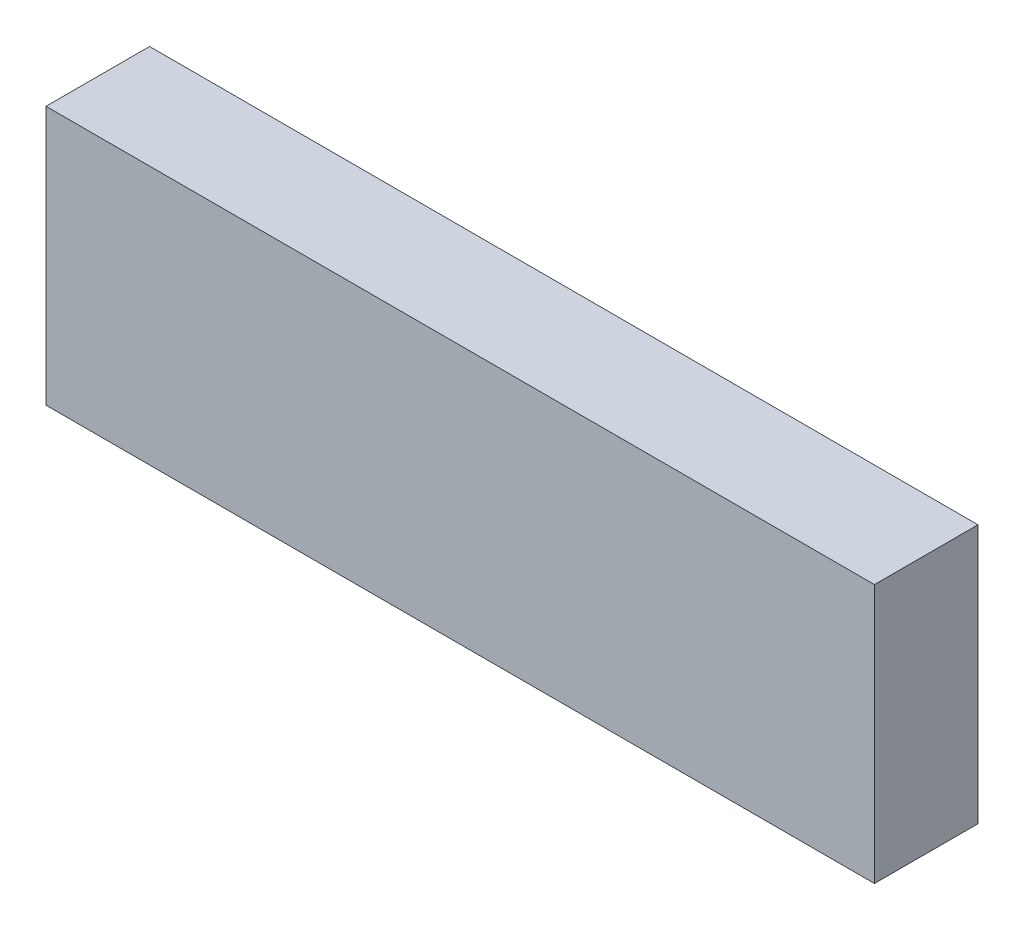
ISO-10303-21;
HEADER;
FILE_DESCRIPTION(('STEP AP214'),'2;1');
FILE_NAME('part.step','',(''),(''),'','','');
FILE_SCHEMA(('AUTOMOTIVE_DESIGN { 1 0 10303 214 1 1 1 1 }'));
ENDSEC;
DATA;
#1=APPLICATION_CONTEXT('core data for automotive mechanical design processes');
#2=APPLICATION_PROTOCOL_DEFINITION('international standard','automotive_design',2000,#1);
#3=PRODUCT_CONTEXT('',#1,'mechanical');
#4=PRODUCT('Part','Part','',(#3));
#5=PRODUCT_RELATED_PRODUCT_CATEGORY('part','',(#4));
#6=PRODUCT_DEFINITION_FORMATION('','',#4);
#7=PRODUCT_DEFINITION_CONTEXT('part definition',#1,'design');
#8=PRODUCT_DEFINITION('design','',#6,#7);
#9=PRODUCT_DEFINITION_SHAPE('','',#8);
#10=(LENGTH_UNIT() NAMED_UNIT(*) SI_UNIT(.MILLI.,.METRE.));
#11=(NAMED_UNIT(*) PLANE_ANGLE_UNIT() SI_UNIT($,.RADIAN.));
#12=(NAMED_UNIT(*) SI_UNIT($,.STERADIAN.) SOLID_ANGLE_UNIT());
#13=UNCERTAINTY_MEASURE_WITH_UNIT(LENGTH_MEASURE(1.E-05),#10,'distance_accuracy_value','');
#14=(GEOMETRIC_REPRESENTATION_CONTEXT(3) GLOBAL_UNCERTAINTY_ASSIGNED_CONTEXT((#13)) GLOBAL_UNIT_ASSIGNED_CONTEXT((#10,
#11,#12)) REPRESENTATION_CONTEXT('',''));
#15=CARTESIAN_POINT('',(0.,0.,0.));
#16=DIRECTION('',(0.,0.,1.));
#17=DIRECTION('',(1.,0.,0.));
#18=AXIS2_PLACEMENT_3D('',#15,#16,#17);
#19=CARTESIAN_POINT('',(0.,0.,3.175));
#20=DIRECTION('',(1.,0.,0.));
#21=DIRECTION('',(0.,0.,-1.));
#22=AXIS2_PLACEMENT_3D('',#19,#20,#21);
#23=PLANE('',#22);
#24=DIRECTION('',(0.,-1.,0.));
#25=VECTOR('',#24,1.);
#26=CARTESIAN_POINT('',(0.,0.,0.));
#27=LINE('',#26,#25);
#28=CARTESIAN_POINT('',(0.,7.9375,0.));
#29=VERTEX_POINT('',#28);
#30=CARTESIAN_POINT('',(0.,0.,0.));
#31=VERTEX_POINT('',#30);
#32=EDGE_CURVE('E102',#29,#31,#27,.T.);
#33=ORIENTED_EDGE('',*,*,#32,.T.);
#34=DIRECTION('',(0.,0.,-1.));
#35=VECTOR('',#34,1.);
#36=CARTESIAN_POINT('',(0.,0.,3.175));
#37=LINE('',#36,#35);
#38=CARTESIAN_POINT('',(0.,0.,3.175));
#39=VERTEX_POINT('',#38);
#40=EDGE_CURVE('E11',#39,#31,#37,.T.);
#41=ORIENTED_EDGE('',*,*,#40,.F.);
#42=DIRECTION('',(0.,-1.,0.));
#43=VECTOR('',#42,1.);
#44=CARTESIAN_POINT('',(0.,0.,3.175));
#45=LINE('',#44,#43);
#46=CARTESIAN_POINT('',(0.,7.9375,3.175));
#47=VERTEX_POINT('',#46);
#48=EDGE_CURVE('E90',#47,#39,#45,.T.);
#49=ORIENTED_EDGE('',*,*,#48,.F.);
#50=DIRECTION('',(0.,0.,-1.));
#51=VECTOR('',#50,1.);
#52=CARTESIAN_POINT('',(0.,7.9375,3.175));
#53=LINE('',#52,#51);
#54=EDGE_CURVE('E98',#47,#29,#53,.T.);
#55=ORIENTED_EDGE('',*,*,#54,.T.);
#56=EDGE_LOOP('',(#33,#41,#49,#55));
#57=FACE_BOUND('',#56,.T.);
#58=ADVANCED_FACE('F39',(#57),#23,.F.);
#59=CARTESIAN_POINT('',(0.,0.,3.175));
#60=DIRECTION('',(0.,1.,0.));
#61=DIRECTION('',(0.,0.,1.));
#62=AXIS2_PLACEMENT_3D('',#59,#60,#61);
#63=PLANE('',#62);
#64=DIRECTION('',(1.,0.,0.));
#65=VECTOR('',#64,1.);
#66=CARTESIAN_POINT('',(0.,0.,0.));
#67=LINE('',#66,#65);
#68=CARTESIAN_POINT('',(25.4,0.,0.));
#69=VERTEX_POINT('',#68);
#70=EDGE_CURVE('E94',#31,#69,#67,.T.);
#71=ORIENTED_EDGE('',*,*,#70,.T.);
#72=DIRECTION('',(0.,0.,-1.));
#73=VECTOR('',#72,1.);
#74=CARTESIAN_POINT('',(25.4,0.,3.175));
#75=LINE('',#74,#73);
#76=CARTESIAN_POINT('',(25.4,0.,3.175));
#77=VERTEX_POINT('',#76);
#78=EDGE_CURVE('E47',#77,#69,#75,.T.);
#79=ORIENTED_EDGE('',*,*,#78,.F.);
#80=DIRECTION('',(1.,0.,0.));
#81=VECTOR('',#80,1.);
#82=CARTESIAN_POINT('',(0.,0.,3.175));
#83=LINE('',#82,#81);
#84=EDGE_CURVE('E85',#39,#77,#83,.T.);
#85=ORIENTED_EDGE('',*,*,#84,.F.);
#86=ORIENTED_EDGE('',*,*,#40,.T.);
#87=EDGE_LOOP('',(#71,#79,#85,#86));
#88=FACE_BOUND('',#87,.T.);
#89=ADVANCED_FACE('F93',(#88),#63,.F.);
#90=CARTESIAN_POINT('',(25.4,0.,3.175));
#91=DIRECTION('',(-1.,0.,0.));
#92=DIRECTION('',(0.,0.,1.));
#93=AXIS2_PLACEMENT_3D('',#90,#91,#92);
#94=PLANE('',#93);
#95=DIRECTION('',(0.,1.,0.));
#96=VECTOR('',#95,1.);
#97=CARTESIAN_POINT('',(25.4,0.,0.));
#98=LINE('',#97,#96);
#99=CARTESIAN_POINT('',(25.4,7.9375,0.));
#100=VERTEX_POINT('',#99);
#101=EDGE_CURVE('E72',#69,#100,#98,.T.);
#102=ORIENTED_EDGE('',*,*,#101,.T.);
#103=DIRECTION('',(0.,0.,-1.));
#104=VECTOR('',#103,1.);
#105=CARTESIAN_POINT('',(25.4,7.9375,3.175));
#106=LINE('',#105,#104);
#107=CARTESIAN_POINT('',(25.4,7.9375,3.175));
#108=VERTEX_POINT('',#107);
#109=EDGE_CURVE('E95',#108,#100,#106,.T.);
#110=ORIENTED_EDGE('',*,*,#109,.F.);
#111=DIRECTION('',(0.,1.,0.));
#112=VECTOR('',#111,1.);
#113=CARTESIAN_POINT('',(25.4,0.,3.175));
#114=LINE('',#113,#112);
#115=EDGE_CURVE('E88',#77,#108,#114,.T.);
#116=ORIENTED_EDGE('',*,*,#115,.F.);
#117=ORIENTED_EDGE('',*,*,#78,.T.);
#118=EDGE_LOOP('',(#102,#110,#116,#117));
#119=FACE_BOUND('',#118,.T.);
#120=ADVANCED_FACE('F96',(#119),#94,.F.);
#121=CARTESIAN_POINT('',(0.,7.9375,3.175));
#122=DIRECTION('',(0.,-1.,0.));
#123=DIRECTION('',(0.,0.,-1.));
#124=AXIS2_PLACEMENT_3D('',#121,#122,#123);
#125=PLANE('',#124);
#126=DIRECTION('',(-1.,0.,0.));
#127=VECTOR('',#126,1.);
#128=CARTESIAN_POINT('',(0.,7.9375,0.));
#129=LINE('',#128,#127);
#130=EDGE_CURVE('E78',#100,#29,#129,.T.);
#131=ORIENTED_EDGE('',*,*,#130,.T.);
#132=ORIENTED_EDGE('',*,*,#54,.F.);
#133=DIRECTION('',(-1.,0.,0.));
#134=VECTOR('',#133,1.);
#135=CARTESIAN_POINT('',(0.,7.9375,3.175));
#136=LINE('',#135,#134);
#137=EDGE_CURVE('E55',#108,#47,#136,.T.);
#138=ORIENTED_EDGE('',*,*,#137,.F.);
#139=ORIENTED_EDGE('',*,*,#109,.T.);
#140=EDGE_LOOP('',(#131,#132,#138,#139));
#141=FACE_BOUND('',#140,.T.);
#142=ADVANCED_FACE('F109',(#141),#125,.F.);
#143=CARTESIAN_POINT('',(0.,0.,3.175));
#144=DIRECTION('',(0.,0.,-1.));
#145=DIRECTION('',(-1.,0.,0.));
#146=AXIS2_PLACEMENT_3D('',#143,#144,#145);
#147=PLANE('',#146);
#148=ORIENTED_EDGE('',*,*,#48,.T.);
#149=ORIENTED_EDGE('',*,*,#84,.T.);
#150=ORIENTED_EDGE('',*,*,#115,.T.);
#151=ORIENTED_EDGE('',*,*,#137,.T.);
#152=EDGE_LOOP('',(#148,#149,#150,#151));
#153=FACE_BOUND('',#152,.T.);
#154=ADVANCED_FACE('F86',(#153),#147,.F.);
#155=CARTESIAN_POINT('',(0.,0.,0.));
#156=DIRECTION('',(0.,0.,-1.));
#157=DIRECTION('',(-1.,0.,0.));
#158=AXIS2_PLACEMENT_3D('',#155,#156,#157);
#159=PLANE('',#158);
#160=ORIENTED_EDGE('',*,*,#32,.F.);
#161=ORIENTED_EDGE('',*,*,#130,.F.);
#162=ORIENTED_EDGE('',*,*,#101,.F.);
#163=ORIENTED_EDGE('',*,*,#70,.F.);
#164=EDGE_LOOP('',(#160,#161,#162,#163));
#165=FACE_BOUND('',#164,.T.);
#166=ADVANCED_FACE('F112',(#165),#159,.T.);
#167=CLOSED_SHELL('',(#58,#89,#120,#142,#154,#166));
#168=MANIFOLD_SOLID_BREP('B2',#167);
#169=ADVANCED_BREP_SHAPE_REPRESENTATION('',(#18,#168),#14);
#170=SHAPE_DEFINITION_REPRESENTATION(#9,#169);
ENDSEC;
END-ISO-10303-21;
